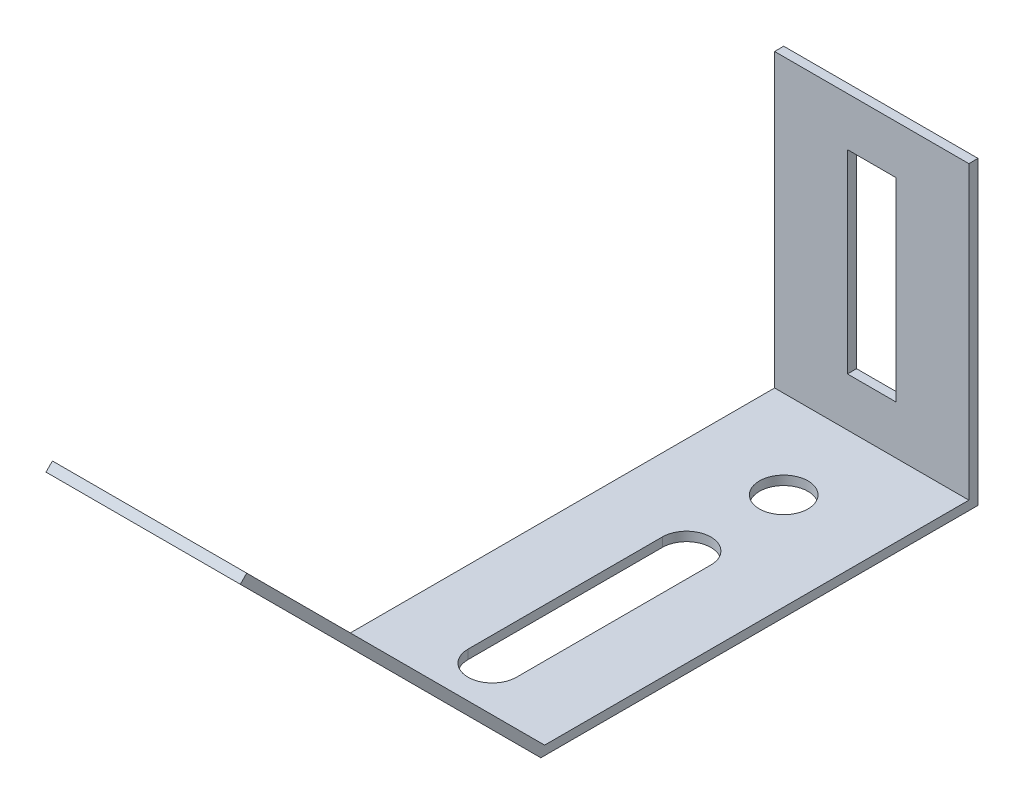
ISO-10303-21;
HEADER;
FILE_DESCRIPTION(('STEP AP214'),'2;1');
FILE_NAME('part.step','',(''),(''),'','','');
FILE_SCHEMA(('AUTOMOTIVE_DESIGN { 1 0 10303 214 1 1 1 1 }'));
ENDSEC;
DATA;
#1=APPLICATION_CONTEXT('core data for automotive mechanical design processes');
#2=APPLICATION_PROTOCOL_DEFINITION('international standard','automotive_design',2000,#1);
#3=PRODUCT_CONTEXT('',#1,'mechanical');
#4=PRODUCT('Part','Part','',(#3));
#5=PRODUCT_RELATED_PRODUCT_CATEGORY('part','',(#4));
#6=PRODUCT_DEFINITION_FORMATION('','',#4);
#7=PRODUCT_DEFINITION_CONTEXT('part definition',#1,'design');
#8=PRODUCT_DEFINITION('design','',#6,#7);
#9=PRODUCT_DEFINITION_SHAPE('','',#8);
#10=(LENGTH_UNIT() NAMED_UNIT(*) SI_UNIT(.MILLI.,.METRE.));
#11=(NAMED_UNIT(*) PLANE_ANGLE_UNIT() SI_UNIT($,.RADIAN.));
#12=(NAMED_UNIT(*) SI_UNIT($,.STERADIAN.) SOLID_ANGLE_UNIT());
#13=UNCERTAINTY_MEASURE_WITH_UNIT(LENGTH_MEASURE(1.E-05),#10,'distance_accuracy_value','');
#14=(GEOMETRIC_REPRESENTATION_CONTEXT(3) GLOBAL_UNCERTAINTY_ASSIGNED_CONTEXT((#13)) GLOBAL_UNIT_ASSIGNED_CONTEXT((#10,
#11,#12)) REPRESENTATION_CONTEXT('',''));
#15=CARTESIAN_POINT('',(0.,0.,0.));
#16=DIRECTION('',(0.,0.,1.));
#17=DIRECTION('',(1.,0.,0.));
#18=AXIS2_PLACEMENT_3D('',#15,#16,#17);
#19=CARTESIAN_POINT('',(0.,0.5953125,0.));
#20=DIRECTION('',(0.,-1.,0.));
#21=DIRECTION('',(0.,0.,-1.));
#22=AXIS2_PLACEMENT_3D('',#19,#20,#21);
#23=PLANE('',#22);
#24=CARTESIAN_POINT('',(0.,0.5953125,-7.9375));
#25=DIRECTION('',(0.,1.,0.));
#26=DIRECTION('',(0.,0.,1.));
#27=AXIS2_PLACEMENT_3D('',#24,#25,#26);
#28=CIRCLE('',#27,1.5875);
#29=CARTESIAN_POINT('',(0.,0.5953125,-9.525));
#30=VERTEX_POINT('',#29);
#31=EDGE_CURVE('E259',#30,#30,#28,.T.);
#32=ORIENTED_EDGE('',*,*,#31,.F.);
#33=EDGE_LOOP('',(#32));
#34=FACE_BOUND('',#33,.T.);
#35=DIRECTION('',(0.,0.,1.));
#36=VECTOR('',#35,1.);
#37=CARTESIAN_POINT('',(-6.35,0.5953125,14.2875));
#38=LINE('',#37,#36);
#39=CARTESIAN_POINT('',(-6.35,0.5953125,-13.6921875));
#40=VERTEX_POINT('',#39);
#41=CARTESIAN_POINT('',(-6.35,0.5953125,14.0409134886498));
#42=VERTEX_POINT('',#41);
#43=EDGE_CURVE('E53',#40,#42,#38,.T.);
#44=ORIENTED_EDGE('',*,*,#43,.T.);
#45=DIRECTION('',(1.,0.,0.));
#46=VECTOR('',#45,1.);
#47=CARTESIAN_POINT('',(-34.6049556212387,0.595312500000001,14.0409134886498));
#48=LINE('',#47,#46);
#49=CARTESIAN_POINT('',(6.35,0.5953125,14.0409134886498));
#50=VERTEX_POINT('',#49);
#51=EDGE_CURVE('E48',#42,#50,#48,.T.);
#52=ORIENTED_EDGE('',*,*,#51,.T.);
#53=DIRECTION('',(0.,0.,-1.));
#54=VECTOR('',#53,1.);
#55=CARTESIAN_POINT('',(6.35,0.5953125,14.2875));
#56=LINE('',#55,#54);
#57=CARTESIAN_POINT('',(6.35,0.5953125,-13.6921875));
#58=VERTEX_POINT('',#57);
#59=EDGE_CURVE('E167',#50,#58,#56,.T.);
#60=ORIENTED_EDGE('',*,*,#59,.T.);
#61=DIRECTION('',(-1.,0.,0.));
#62=VECTOR('',#61,1.);
#63=CARTESIAN_POINT('',(6.35,0.5953125,-13.6921875));
#64=LINE('',#63,#62);
#65=EDGE_CURVE('E211',#58,#40,#64,.T.);
#66=ORIENTED_EDGE('',*,*,#65,.T.);
#67=EDGE_LOOP('',(#44,#52,#60,#66));
#68=FACE_BOUND('',#67,.T.);
#69=CARTESIAN_POINT('',(0.,0.5953125,-1.5875));
#70=DIRECTION('',(0.,1.,0.));
#71=DIRECTION('',(0.,0.,1.));
#72=AXIS2_PLACEMENT_3D('',#69,#70,#71);
#73=CIRCLE('',#72,1.5875);
#74=CARTESIAN_POINT('',(1.5875,0.5953125,-1.5875));
#75=VERTEX_POINT('',#74);
#76=CARTESIAN_POINT('',(-1.5875,0.5953125,-1.5875));
#77=VERTEX_POINT('',#76);
#78=EDGE_CURVE('E228',#75,#77,#73,.T.);
#79=ORIENTED_EDGE('',*,*,#78,.F.);
#80=DIRECTION('',(0.,0.,-1.));
#81=VECTOR('',#80,1.);
#82=CARTESIAN_POINT('',(1.5875,0.5953125,-1.5875));
#83=LINE('',#82,#81);
#84=CARTESIAN_POINT('',(1.5875,0.5953125,11.1125));
#85=VERTEX_POINT('',#84);
#86=EDGE_CURVE('E236',#85,#75,#83,.T.);
#87=ORIENTED_EDGE('',*,*,#86,.F.);
#88=CARTESIAN_POINT('',(0.,0.5953125,11.1125));
#89=DIRECTION('',(0.,1.,0.));
#90=DIRECTION('',(0.,0.,1.));
#91=AXIS2_PLACEMENT_3D('',#88,#89,#90);
#92=CIRCLE('',#91,1.5875);
#93=CARTESIAN_POINT('',(-1.5875,0.5953125,11.1125));
#94=VERTEX_POINT('',#93);
#95=EDGE_CURVE('E233',#94,#85,#92,.T.);
#96=ORIENTED_EDGE('',*,*,#95,.F.);
#97=DIRECTION('',(0.,0.,1.));
#98=VECTOR('',#97,1.);
#99=CARTESIAN_POINT('',(-1.5875,0.5953125,-1.5875));
#100=LINE('',#99,#98);
#101=EDGE_CURVE('E230',#77,#94,#100,.T.);
#102=ORIENTED_EDGE('',*,*,#101,.F.);
#103=EDGE_LOOP('',(#79,#87,#96,#102));
#104=FACE_BOUND('',#103,.T.);
#105=ADVANCED_FACE('F33',(#34,#68,#104),#23,.F.);
#106=CARTESIAN_POINT('',(0.,0.,0.));
#107=DIRECTION('',(0.,-1.,0.));
#108=DIRECTION('',(0.,0.,-1.));
#109=AXIS2_PLACEMENT_3D('',#106,#107,#108);
#110=PLANE('',#109);
#111=DIRECTION('',(0.,0.,-1.));
#112=VECTOR('',#111,1.);
#113=CARTESIAN_POINT('',(6.35,0.,14.2875));
#114=LINE('',#113,#112);
#115=CARTESIAN_POINT('',(6.35,0.,14.2875));
#116=VERTEX_POINT('',#115);
#117=CARTESIAN_POINT('',(6.35,0.,-14.2875));
#118=VERTEX_POINT('',#117);
#119=EDGE_CURVE('E262',#116,#118,#114,.T.);
#120=ORIENTED_EDGE('',*,*,#119,.F.);
#121=DIRECTION('',(1.,0.,0.));
#122=VECTOR('',#121,1.);
#123=CARTESIAN_POINT('',(-6.35,0.,14.2875));
#124=LINE('',#123,#122);
#125=CARTESIAN_POINT('',(-6.34999999999999,0.,14.2875));
#126=VERTEX_POINT('',#125);
#127=EDGE_CURVE('E266',#126,#116,#124,.T.);
#128=ORIENTED_EDGE('',*,*,#127,.F.);
#129=DIRECTION('',(0.,0.,1.));
#130=VECTOR('',#129,1.);
#131=CARTESIAN_POINT('',(-6.35,0.,14.2875));
#132=LINE('',#131,#130);
#133=CARTESIAN_POINT('',(-6.35,0.,-14.2875));
#134=VERTEX_POINT('',#133);
#135=EDGE_CURVE('E272',#134,#126,#132,.T.);
#136=ORIENTED_EDGE('',*,*,#135,.F.);
#137=DIRECTION('',(-1.,0.,0.));
#138=VECTOR('',#137,1.);
#139=CARTESIAN_POINT('',(-6.35,0.,-14.2875));
#140=LINE('',#139,#138);
#141=EDGE_CURVE('E270',#118,#134,#140,.T.);
#142=ORIENTED_EDGE('',*,*,#141,.F.);
#143=EDGE_LOOP('',(#120,#128,#136,#142));
#144=FACE_BOUND('',#143,.T.);
#145=CARTESIAN_POINT('',(0.,0.,-7.9375));
#146=DIRECTION('',(0.,1.,0.));
#147=DIRECTION('',(0.,0.,1.));
#148=AXIS2_PLACEMENT_3D('',#145,#146,#147);
#149=CIRCLE('',#148,1.5875);
#150=CARTESIAN_POINT('',(0.,0.,-9.525));
#151=VERTEX_POINT('',#150);
#152=EDGE_CURVE('E258',#151,#151,#149,.T.);
#153=ORIENTED_EDGE('',*,*,#152,.T.);
#154=EDGE_LOOP('',(#153));
#155=FACE_BOUND('',#154,.T.);
#156=DIRECTION('',(0.,0.,-1.));
#157=VECTOR('',#156,1.);
#158=CARTESIAN_POINT('',(1.5875,0.,-1.5875));
#159=LINE('',#158,#157);
#160=CARTESIAN_POINT('',(1.5875,0.,11.1125));
#161=VERTEX_POINT('',#160);
#162=CARTESIAN_POINT('',(1.5875,0.,-1.5875));
#163=VERTEX_POINT('',#162);
#164=EDGE_CURVE('E231',#161,#163,#159,.T.);
#165=ORIENTED_EDGE('',*,*,#164,.T.);
#166=CARTESIAN_POINT('',(0.,0.,-1.5875));
#167=DIRECTION('',(0.,1.,0.));
#168=DIRECTION('',(0.,0.,1.));
#169=AXIS2_PLACEMENT_3D('',#166,#167,#168);
#170=CIRCLE('',#169,1.5875);
#171=CARTESIAN_POINT('',(-1.5875,0.,-1.5875));
#172=VERTEX_POINT('',#171);
#173=EDGE_CURVE('E225',#163,#172,#170,.T.);
#174=ORIENTED_EDGE('',*,*,#173,.T.);
#175=DIRECTION('',(0.,0.,1.));
#176=VECTOR('',#175,1.);
#177=CARTESIAN_POINT('',(-1.5875,0.,-1.5875));
#178=LINE('',#177,#176);
#179=CARTESIAN_POINT('',(-1.5875,0.,11.1125));
#180=VERTEX_POINT('',#179);
#181=EDGE_CURVE('E241',#172,#180,#178,.T.);
#182=ORIENTED_EDGE('',*,*,#181,.T.);
#183=CARTESIAN_POINT('',(0.,0.,11.1125));
#184=DIRECTION('',(0.,1.,0.));
#185=DIRECTION('',(0.,0.,1.));
#186=AXIS2_PLACEMENT_3D('',#183,#184,#185);
#187=CIRCLE('',#186,1.5875);
#188=EDGE_CURVE('E244',#180,#161,#187,.T.);
#189=ORIENTED_EDGE('',*,*,#188,.T.);
#190=EDGE_LOOP('',(#165,#174,#182,#189));
#191=FACE_BOUND('',#190,.T.);
#192=ADVANCED_FACE('F284',(#144,#155,#191),#110,.T.);
#193=CARTESIAN_POINT('',(6.35,0.5953125,14.2875));
#194=DIRECTION('',(-1.,0.,0.));
#195=DIRECTION('',(0.,0.,1.));
#196=AXIS2_PLACEMENT_3D('',#193,#194,#195);
#197=PLANE('',#196);
#198=ORIENTED_EDGE('',*,*,#59,.F.);
#199=DIRECTION('',(0.,0.707106781186544,0.707106781186551));
#200=VECTOR('',#199,1.);
#201=CARTESIAN_POINT('',(6.35,0.595312500000001,14.0409134886498));
#202=LINE('',#201,#200);
#203=CARTESIAN_POINT('',(6.35,20.0662620056751,33.5118629943251));
#204=VERTEX_POINT('',#203);
#205=EDGE_CURVE('E151',#50,#204,#202,.T.);
#206=ORIENTED_EDGE('',*,*,#205,.T.);
#207=DIRECTION('',(0.,-0.707106781186556,0.707106781186539));
#208=VECTOR('',#207,1.);
#209=CARTESIAN_POINT('',(6.35,20.0662620056751,33.5118629943251));
#210=LINE('',#209,#208);
#211=CARTESIAN_POINT('',(6.35,19.6453125,33.9328125000002));
#212=VERTEX_POINT('',#211);
#213=EDGE_CURVE('E158',#204,#212,#210,.T.);
#214=ORIENTED_EDGE('',*,*,#213,.T.);
#215=DIRECTION('',(0.,-0.707106781186543,-0.707106781186551));
#216=VECTOR('',#215,1.);
#217=CARTESIAN_POINT('',(6.35,0.,14.2875));
#218=LINE('',#217,#216);
#219=EDGE_CURVE('E164',#212,#116,#218,.T.);
#220=ORIENTED_EDGE('',*,*,#219,.T.);
#221=ORIENTED_EDGE('',*,*,#119,.T.);
#222=DIRECTION('',(0.,-1.,0.));
#223=VECTOR('',#222,1.);
#224=CARTESIAN_POINT('',(6.35,0.5953125,-14.2875));
#225=LINE('',#224,#223);
#226=CARTESIAN_POINT('',(6.35,19.6453125,-14.2875));
#227=VERTEX_POINT('',#226);
#228=EDGE_CURVE('E11',#227,#118,#225,.T.);
#229=ORIENTED_EDGE('',*,*,#228,.F.);
#230=DIRECTION('',(0.,0.,-1.));
#231=VECTOR('',#230,1.);
#232=CARTESIAN_POINT('',(6.35,19.6453125,-13.6921875));
#233=LINE('',#232,#231);
#234=CARTESIAN_POINT('',(6.35,19.6453125,-13.6921875));
#235=VERTEX_POINT('',#234);
#236=EDGE_CURVE('E222',#235,#227,#233,.T.);
#237=ORIENTED_EDGE('',*,*,#236,.F.);
#238=DIRECTION('',(0.,-1.,0.));
#239=VECTOR('',#238,1.);
#240=CARTESIAN_POINT('',(6.35,0.5953125,-13.6921875));
#241=LINE('',#240,#239);
#242=EDGE_CURVE('E209',#235,#58,#241,.T.);
#243=ORIENTED_EDGE('',*,*,#242,.T.);
#244=EDGE_LOOP('',(#198,#206,#214,#220,#221,#229,#237,#243));
#245=FACE_BOUND('',#244,.T.);
#246=ADVANCED_FACE('F35',(#245),#197,.F.);
#247=CARTESIAN_POINT('',(-6.35,0.5953125,-14.2875));
#248=DIRECTION('',(0.,0.,1.));
#249=DIRECTION('',(1.,0.,0.));
#250=AXIS2_PLACEMENT_3D('',#247,#248,#249);
#251=PLANE('',#250);
#252=ORIENTED_EDGE('',*,*,#141,.T.);
#253=DIRECTION('',(0.,-1.,0.));
#254=VECTOR('',#253,1.);
#255=CARTESIAN_POINT('',(-6.35,0.5953125,-14.2875));
#256=LINE('',#255,#254);
#257=CARTESIAN_POINT('',(-6.35,19.6453125,-14.2875));
#258=VERTEX_POINT('',#257);
#259=EDGE_CURVE('E41',#258,#134,#256,.T.);
#260=ORIENTED_EDGE('',*,*,#259,.F.);
#261=DIRECTION('',(1.,0.,0.));
#262=VECTOR('',#261,1.);
#263=CARTESIAN_POINT('',(6.35,19.6453125,-14.2875));
#264=LINE('',#263,#262);
#265=EDGE_CURVE('E202',#258,#227,#264,.T.);
#266=ORIENTED_EDGE('',*,*,#265,.T.);
#267=ORIENTED_EDGE('',*,*,#228,.T.);
#268=EDGE_LOOP('',(#252,#260,#266,#267));
#269=FACE_BOUND('',#268,.T.);
#270=DIRECTION('',(1.,0.,0.));
#271=VECTOR('',#270,1.);
#272=CARTESIAN_POINT('',(-1.5875,16.4703125,-14.2875));
#273=LINE('',#272,#271);
#274=CARTESIAN_POINT('',(-1.5875,16.4703125,-14.2875));
#275=VERTEX_POINT('',#274);
#276=CARTESIAN_POINT('',(1.5875,16.4703125,-14.2875));
#277=VERTEX_POINT('',#276);
#278=EDGE_CURVE('E192',#275,#277,#273,.T.);
#279=ORIENTED_EDGE('',*,*,#278,.F.);
#280=DIRECTION('',(0.,1.,0.));
#281=VECTOR('',#280,1.);
#282=CARTESIAN_POINT('',(-1.5875,16.4703125,-14.2875));
#283=LINE('',#282,#281);
#284=CARTESIAN_POINT('',(-1.5875,3.7703125,-14.2875));
#285=VERTEX_POINT('',#284);
#286=EDGE_CURVE('E190',#285,#275,#283,.T.);
#287=ORIENTED_EDGE('',*,*,#286,.F.);
#288=DIRECTION('',(-1.,0.,0.));
#289=VECTOR('',#288,1.);
#290=CARTESIAN_POINT('',(-1.5875,3.7703125,-14.2875));
#291=LINE('',#290,#289);
#292=CARTESIAN_POINT('',(1.5875,3.7703125,-14.2875));
#293=VERTEX_POINT('',#292);
#294=EDGE_CURVE('E180',#293,#285,#291,.T.);
#295=ORIENTED_EDGE('',*,*,#294,.F.);
#296=DIRECTION('',(0.,-1.,0.));
#297=VECTOR('',#296,1.);
#298=CARTESIAN_POINT('',(1.5875,16.4703125,-14.2875));
#299=LINE('',#298,#297);
#300=EDGE_CURVE('E195',#277,#293,#299,.T.);
#301=ORIENTED_EDGE('',*,*,#300,.F.);
#302=EDGE_LOOP('',(#279,#287,#295,#301));
#303=FACE_BOUND('',#302,.T.);
#304=ADVANCED_FACE('F292',(#269,#303),#251,.F.);
#305=CARTESIAN_POINT('',(-6.35,0.5953125,14.2875));
#306=DIRECTION('',(1.,0.,0.));
#307=DIRECTION('',(0.,0.,-1.));
#308=AXIS2_PLACEMENT_3D('',#305,#306,#307);
#309=PLANE('',#308);
#310=ORIENTED_EDGE('',*,*,#135,.T.);
#311=DIRECTION('',(0.,0.707106781186544,0.707106781186552));
#312=VECTOR('',#311,1.);
#313=CARTESIAN_POINT('',(-6.34999999999999,0.,14.2875));
#314=LINE('',#313,#312);
#315=CARTESIAN_POINT('',(-6.35,19.6453125,33.9328125000002));
#316=VERTEX_POINT('',#315);
#317=EDGE_CURVE('E170',#126,#316,#314,.T.);
#318=ORIENTED_EDGE('',*,*,#317,.T.);
#319=DIRECTION('',(0.,0.707106781186556,-0.707106781186539));
#320=VECTOR('',#319,1.);
#321=CARTESIAN_POINT('',(-6.35,20.0662620056751,33.5118629943251));
#322=LINE('',#321,#320);
#323=CARTESIAN_POINT('',(-6.35,20.0662620056751,33.5118629943251));
#324=VERTEX_POINT('',#323);
#325=EDGE_CURVE('E318',#316,#324,#322,.T.);
#326=ORIENTED_EDGE('',*,*,#325,.T.);
#327=DIRECTION('',(0.,-0.707106781186544,-0.707106781186551));
#328=VECTOR('',#327,1.);
#329=CARTESIAN_POINT('',(-6.35,0.595312500000001,14.0409134886498));
#330=LINE('',#329,#328);
#331=EDGE_CURVE('E152',#324,#42,#330,.T.);
#332=ORIENTED_EDGE('',*,*,#331,.T.);
#333=ORIENTED_EDGE('',*,*,#43,.F.);
#334=DIRECTION('',(0.,1.,0.));
#335=VECTOR('',#334,1.);
#336=CARTESIAN_POINT('',(-6.35,0.5953125,-13.6921875));
#337=LINE('',#336,#335);
#338=CARTESIAN_POINT('',(-6.35,19.6453125,-13.6921875));
#339=VERTEX_POINT('',#338);
#340=EDGE_CURVE('E213',#40,#339,#337,.T.);
#341=ORIENTED_EDGE('',*,*,#340,.T.);
#342=DIRECTION('',(0.,0.,-1.));
#343=VECTOR('',#342,1.);
#344=CARTESIAN_POINT('',(-6.35,19.6453125,-13.6921875));
#345=LINE('',#344,#343);
#346=EDGE_CURVE('E219',#339,#258,#345,.T.);
#347=ORIENTED_EDGE('',*,*,#346,.T.);
#348=ORIENTED_EDGE('',*,*,#259,.T.);
#349=EDGE_LOOP('',(#310,#318,#326,#332,#333,#341,#347,#348));
#350=FACE_BOUND('',#349,.T.);
#351=ADVANCED_FACE('F279',(#350),#309,.F.);
#352=CARTESIAN_POINT('',(0.,0.5953125,-7.9375));
#353=DIRECTION('',(0.,-1.,0.));
#354=DIRECTION('',(0.,0.,-1.));
#355=AXIS2_PLACEMENT_3D('',#352,#353,#354);
#356=CYLINDRICAL_SURFACE('',#355,1.5875);
#357=CARTESIAN_POINT('',(0.,0.5953125,-9.525));
#358=CARTESIAN_POINT('',(0.,0.589111328125,-9.525));
#359=CARTESIAN_POINT('',(0.,0.58291015625,-9.525));
#360=CARTESIAN_POINT('',(0.,0.5705078125,-9.525));
#361=CARTESIAN_POINT('',(0.,0.564306640625,-9.525));
#362=CARTESIAN_POINT('',(0.,0.551904296875,-9.525));
#363=CARTESIAN_POINT('',(0.,0.545703125,-9.525));
#364=CARTESIAN_POINT('',(0.,0.53330078125,-9.525));
#365=CARTESIAN_POINT('',(0.,0.527099609375,-9.525));
#366=CARTESIAN_POINT('',(0.,0.514697265625,-9.525));
#367=CARTESIAN_POINT('',(0.,0.50849609375,-9.525));
#368=CARTESIAN_POINT('',(0.,0.49609375,-9.525));
#369=CARTESIAN_POINT('',(0.,0.489892578125,-9.525));
#370=CARTESIAN_POINT('',(0.,0.477490234375,-9.525));
#371=CARTESIAN_POINT('',(0.,0.4712890625,-9.525));
#372=CARTESIAN_POINT('',(0.,0.45888671875,-9.525));
#373=CARTESIAN_POINT('',(0.,0.452685546875,-9.525));
#374=CARTESIAN_POINT('',(0.,0.440283203125,-9.525));
#375=CARTESIAN_POINT('',(0.,0.43408203125,-9.525));
#376=CARTESIAN_POINT('',(0.,0.4216796875,-9.525));
#377=CARTESIAN_POINT('',(0.,0.415478515625,-9.525));
#378=CARTESIAN_POINT('',(0.,0.403076171875,-9.525));
#379=CARTESIAN_POINT('',(0.,0.396875,-9.525));
#380=CARTESIAN_POINT('',(0.,0.38447265625,-9.525));
#381=CARTESIAN_POINT('',(0.,0.378271484375,-9.525));
#382=CARTESIAN_POINT('',(0.,0.365869140625,-9.525));
#383=CARTESIAN_POINT('',(0.,0.35966796875,-9.525));
#384=CARTESIAN_POINT('',(0.,0.347265625,-9.525));
#385=CARTESIAN_POINT('',(0.,0.341064453125,-9.525));
#386=CARTESIAN_POINT('',(0.,0.328662109375,-9.525));
#387=CARTESIAN_POINT('',(0.,0.3224609375,-9.525));
#388=CARTESIAN_POINT('',(0.,0.31005859375,-9.525));
#389=CARTESIAN_POINT('',(0.,0.303857421875,-9.525));
#390=CARTESIAN_POINT('',(0.,0.291455078125,-9.525));
#391=CARTESIAN_POINT('',(0.,0.28525390625,-9.525));
#392=CARTESIAN_POINT('',(0.,0.2728515625,-9.525));
#393=CARTESIAN_POINT('',(0.,0.266650390625,-9.525));
#394=CARTESIAN_POINT('',(0.,0.254248046875,-9.525));
#395=CARTESIAN_POINT('',(0.,0.248046875,-9.525));
#396=CARTESIAN_POINT('',(0.,0.23564453125,-9.525));
#397=CARTESIAN_POINT('',(0.,0.229443359375,-9.525));
#398=CARTESIAN_POINT('',(0.,0.217041015625,-9.525));
#399=CARTESIAN_POINT('',(0.,0.21083984375,-9.525));
#400=CARTESIAN_POINT('',(0.,0.1984375,-9.525));
#401=CARTESIAN_POINT('',(0.,0.192236328125,-9.525));
#402=CARTESIAN_POINT('',(0.,0.179833984375,-9.525));
#403=CARTESIAN_POINT('',(0.,0.1736328125,-9.525));
#404=CARTESIAN_POINT('',(0.,0.16123046875,-9.525));
#405=CARTESIAN_POINT('',(0.,0.155029296875,-9.525));
#406=CARTESIAN_POINT('',(0.,0.142626953125,-9.525));
#407=CARTESIAN_POINT('',(0.,0.13642578125,-9.525));
#408=CARTESIAN_POINT('',(0.,0.1240234375,-9.525));
#409=CARTESIAN_POINT('',(0.,0.117822265625,-9.525));
#410=CARTESIAN_POINT('',(0.,0.105419921875,-9.525));
#411=CARTESIAN_POINT('',(0.,0.09921875,-9.525));
#412=CARTESIAN_POINT('',(0.,0.08681640625,-9.525));
#413=CARTESIAN_POINT('',(0.,0.0806152343750001,-9.525));
#414=CARTESIAN_POINT('',(0.,0.068212890625,-9.525));
#415=CARTESIAN_POINT('',(0.,0.06201171875,-9.525));
#416=CARTESIAN_POINT('',(0.,0.049609375,-9.525));
#417=CARTESIAN_POINT('',(0.,0.043408203125,-9.525));
#418=CARTESIAN_POINT('',(0.,0.031005859375,-9.525));
#419=CARTESIAN_POINT('',(0.,0.0248046875,-9.525));
#420=CARTESIAN_POINT('',(0.,0.01240234375,-9.525));
#421=CARTESIAN_POINT('',(0.,0.00620117187500001,-9.525));
#422=CARTESIAN_POINT('',(0.,0.,-9.525));
#423=B_SPLINE_CURVE_WITH_KNOTS('',3,(#357,#358,#359,#360,#361,#362,#363,#364,#365,#366,#367,
#368,#369,#370,#371,#372,#373,#374,#375,#376,#377,#378,#379,#380,#381,#382,#383,#384,#385,#386,
#387,#388,#389,#390,#391,#392,#393,#394,#395,#396,#397,#398,#399,#400,#401,#402,#403,#404,#405,
#406,#407,#408,#409,#410,#411,#412,#413,#414,#415,#416,#417,#418,#419,#420,#421,#422),
.UNSPECIFIED.,.F.,.F.,(4,2,2,2,2,2,2,2,2,2,2,2,2,2,2,2,2,2,2,2,2,2,2,2,2,2,2,2,2,2,2,2,4),(0.,
0.0186035156249999,0.0372070312499999,0.0558105468749999,0.0744140624999999,0.0930175781249999,
0.11162109375,0.130224609375,0.148828125,0.167431640625,0.18603515625,0.204638671875,
0.2232421875,0.241845703125,0.26044921875,0.279052734375,0.29765625,0.316259765625,
0.33486328125,0.353466796875,0.3720703125,0.390673828125,0.40927734375,0.427880859375,
0.446484375,0.465087890625,0.48369140625,0.502294921875,0.5208984375,0.539501953125,
0.55810546875,0.576708984375,0.5953125),.UNSPECIFIED.);
#424=EDGE_CURVE('BSEAM353',#30,#151,#423,.T.);
#425=ORIENTED_EDGE('',*,*,#31,.T.);
#426=ORIENTED_EDGE('',*,*,#152,.F.);
#427=ORIENTED_EDGE('',*,*,#424,.T.);
#428=ORIENTED_EDGE('',*,*,#424,.F.);
#429=EDGE_LOOP('',(#425,#427,#426,#428));
#430=FACE_BOUND('',#429,.T.);
#431=ADVANCED_FACE('F353',(#430),#356,.F.);
#432=CARTESIAN_POINT('',(0.,0.5953125,-1.5875));
#433=DIRECTION('',(0.,-1.,0.));
#434=DIRECTION('',(0.,0.,-1.));
#435=AXIS2_PLACEMENT_3D('',#432,#433,#434);
#436=CYLINDRICAL_SURFACE('',#435,1.5875);
#437=ORIENTED_EDGE('',*,*,#173,.F.);
#438=DIRECTION('',(0.,-1.,0.));
#439=VECTOR('',#438,1.);
#440=CARTESIAN_POINT('',(1.5875,0.5953125,-1.5875));
#441=LINE('',#440,#439);
#442=EDGE_CURVE('E238',#75,#163,#441,.T.);
#443=ORIENTED_EDGE('',*,*,#442,.F.);
#444=ORIENTED_EDGE('',*,*,#78,.T.);
#445=DIRECTION('',(0.,-1.,0.));
#446=VECTOR('',#445,1.);
#447=CARTESIAN_POINT('',(-1.5875,0.5953125,-1.5875));
#448=LINE('',#447,#446);
#449=EDGE_CURVE('E255',#77,#172,#448,.T.);
#450=ORIENTED_EDGE('',*,*,#449,.T.);
#451=EDGE_LOOP('',(#437,#443,#444,#450));
#452=FACE_BOUND('',#451,.T.);
#453=ADVANCED_FACE('F330',(#452),#436,.F.);
#454=CARTESIAN_POINT('',(-1.5875,0.5953125,-1.5875));
#455=DIRECTION('',(1.,0.,0.));
#456=DIRECTION('',(0.,0.,-1.));
#457=AXIS2_PLACEMENT_3D('',#454,#455,#456);
#458=PLANE('',#457);
#459=ORIENTED_EDGE('',*,*,#181,.F.);
#460=ORIENTED_EDGE('',*,*,#449,.F.);
#461=ORIENTED_EDGE('',*,*,#101,.T.);
#462=DIRECTION('',(0.,-1.,0.));
#463=VECTOR('',#462,1.);
#464=CARTESIAN_POINT('',(-1.5875,0.5953125,11.1125));
#465=LINE('',#464,#463);
#466=EDGE_CURVE('E253',#94,#180,#465,.T.);
#467=ORIENTED_EDGE('',*,*,#466,.T.);
#468=EDGE_LOOP('',(#459,#460,#461,#467));
#469=FACE_BOUND('',#468,.T.);
#470=ADVANCED_FACE('F332',(#469),#458,.T.);
#471=CARTESIAN_POINT('',(0.,0.5953125,11.1125));
#472=DIRECTION('',(0.,-1.,0.));
#473=DIRECTION('',(0.,0.,-1.));
#474=AXIS2_PLACEMENT_3D('',#471,#472,#473);
#475=CYLINDRICAL_SURFACE('',#474,1.5875);
#476=ORIENTED_EDGE('',*,*,#188,.F.);
#477=ORIENTED_EDGE('',*,*,#466,.F.);
#478=ORIENTED_EDGE('',*,*,#95,.T.);
#479=DIRECTION('',(0.,-1.,0.));
#480=VECTOR('',#479,1.);
#481=CARTESIAN_POINT('',(1.5875,0.5953125,11.1125));
#482=LINE('',#481,#480);
#483=EDGE_CURVE('E251',#85,#161,#482,.T.);
#484=ORIENTED_EDGE('',*,*,#483,.T.);
#485=EDGE_LOOP('',(#476,#477,#478,#484));
#486=FACE_BOUND('',#485,.T.);
#487=ADVANCED_FACE('F340',(#486),#475,.F.);
#488=CARTESIAN_POINT('',(1.5875,0.5953125,-1.5875));
#489=DIRECTION('',(-1.,0.,0.));
#490=DIRECTION('',(0.,0.,1.));
#491=AXIS2_PLACEMENT_3D('',#488,#489,#490);
#492=PLANE('',#491);
#493=ORIENTED_EDGE('',*,*,#164,.F.);
#494=ORIENTED_EDGE('',*,*,#483,.F.);
#495=ORIENTED_EDGE('',*,*,#86,.T.);
#496=ORIENTED_EDGE('',*,*,#442,.T.);
#497=EDGE_LOOP('',(#493,#494,#495,#496));
#498=FACE_BOUND('',#497,.T.);
#499=ADVANCED_FACE('F338',(#498),#492,.T.);
#500=CARTESIAN_POINT('',(6.35,19.6453125,-13.6921875));
#501=DIRECTION('',(0.,1.,0.));
#502=DIRECTION('',(0.,0.,1.));
#503=AXIS2_PLACEMENT_3D('',#500,#501,#502);
#504=PLANE('',#503);
#505=ORIENTED_EDGE('',*,*,#265,.F.);
#506=ORIENTED_EDGE('',*,*,#346,.F.);
#507=DIRECTION('',(1.,0.,0.));
#508=VECTOR('',#507,1.);
#509=CARTESIAN_POINT('',(6.35,19.6453125,-13.6921875));
#510=LINE('',#509,#508);
#511=EDGE_CURVE('E216',#339,#235,#510,.T.);
#512=ORIENTED_EDGE('',*,*,#511,.T.);
#513=ORIENTED_EDGE('',*,*,#236,.T.);
#514=EDGE_LOOP('',(#505,#506,#512,#513));
#515=FACE_BOUND('',#514,.T.);
#516=ADVANCED_FACE('F290',(#515),#504,.T.);
#517=CARTESIAN_POINT('',(0.,0.,-13.6921875));
#518=DIRECTION('',(0.,0.,1.));
#519=DIRECTION('',(1.,0.,0.));
#520=AXIS2_PLACEMENT_3D('',#517,#518,#519);
#521=PLANE('',#520);
#522=DIRECTION('',(0.,1.,0.));
#523=VECTOR('',#522,1.);
#524=CARTESIAN_POINT('',(-1.5875,16.4703125,-13.6921875));
#525=LINE('',#524,#523);
#526=CARTESIAN_POINT('',(-1.5875,3.7703125,-13.6921875));
#527=VERTEX_POINT('',#526);
#528=CARTESIAN_POINT('',(-1.5875,16.4703125,-13.6921875));
#529=VERTEX_POINT('',#528);
#530=EDGE_CURVE('E176',#527,#529,#525,.T.);
#531=ORIENTED_EDGE('',*,*,#530,.T.);
#532=DIRECTION('',(1.,0.,0.));
#533=VECTOR('',#532,1.);
#534=CARTESIAN_POINT('',(-1.5875,16.4703125,-13.6921875));
#535=LINE('',#534,#533);
#536=CARTESIAN_POINT('',(1.5875,16.4703125,-13.6921875));
#537=VERTEX_POINT('',#536);
#538=EDGE_CURVE('E179',#529,#537,#535,.T.);
#539=ORIENTED_EDGE('',*,*,#538,.T.);
#540=DIRECTION('',(0.,-1.,0.));
#541=VECTOR('',#540,1.);
#542=CARTESIAN_POINT('',(1.5875,16.4703125,-13.6921875));
#543=LINE('',#542,#541);
#544=CARTESIAN_POINT('',(1.5875,3.7703125,-13.6921875));
#545=VERTEX_POINT('',#544);
#546=EDGE_CURVE('E183',#537,#545,#543,.T.);
#547=ORIENTED_EDGE('',*,*,#546,.T.);
#548=DIRECTION('',(-1.,0.,0.));
#549=VECTOR('',#548,1.);
#550=CARTESIAN_POINT('',(-1.5875,3.7703125,-13.6921875));
#551=LINE('',#550,#549);
#552=EDGE_CURVE('E186',#545,#527,#551,.T.);
#553=ORIENTED_EDGE('',*,*,#552,.T.);
#554=EDGE_LOOP('',(#531,#539,#547,#553));
#555=FACE_BOUND('',#554,.T.);
#556=ORIENTED_EDGE('',*,*,#242,.F.);
#557=ORIENTED_EDGE('',*,*,#511,.F.);
#558=ORIENTED_EDGE('',*,*,#340,.F.);
#559=ORIENTED_EDGE('',*,*,#65,.F.);
#560=EDGE_LOOP('',(#556,#557,#558,#559));
#561=FACE_BOUND('',#560,.T.);
#562=ADVANCED_FACE('F312',(#555,#561),#521,.T.);
#563=CARTESIAN_POINT('',(-1.5875,16.4703125,-13.6921875));
#564=DIRECTION('',(-1.,0.,0.));
#565=DIRECTION('',(0.,-1.,0.));
#566=AXIS2_PLACEMENT_3D('',#563,#564,#565);
#567=PLANE('',#566);
#568=ORIENTED_EDGE('',*,*,#286,.T.);
#569=DIRECTION('',(0.,0.,-1.));
#570=VECTOR('',#569,1.);
#571=CARTESIAN_POINT('',(-1.5875,16.4703125,-13.6921875));
#572=LINE('',#571,#570);
#573=EDGE_CURVE('E189',#529,#275,#572,.T.);
#574=ORIENTED_EDGE('',*,*,#573,.F.);
#575=ORIENTED_EDGE('',*,*,#530,.F.);
#576=DIRECTION('',(0.,0.,-1.));
#577=VECTOR('',#576,1.);
#578=CARTESIAN_POINT('',(-1.5875,3.7703125,-13.6921875));
#579=LINE('',#578,#577);
#580=EDGE_CURVE('E200',#527,#285,#579,.T.);
#581=ORIENTED_EDGE('',*,*,#580,.T.);
#582=EDGE_LOOP('',(#568,#574,#575,#581));
#583=FACE_BOUND('',#582,.T.);
#584=ADVANCED_FACE('F305',(#583),#567,.F.);
#585=CARTESIAN_POINT('',(-1.5875,3.7703125,-13.6921875));
#586=DIRECTION('',(0.,-1.,0.));
#587=DIRECTION('',(0.,0.,-1.));
#588=AXIS2_PLACEMENT_3D('',#585,#586,#587);
#589=PLANE('',#588);
#590=ORIENTED_EDGE('',*,*,#294,.T.);
#591=ORIENTED_EDGE('',*,*,#580,.F.);
#592=ORIENTED_EDGE('',*,*,#552,.F.);
#593=DIRECTION('',(0.,0.,-1.));
#594=VECTOR('',#593,1.);
#595=CARTESIAN_POINT('',(1.5875,3.7703125,-13.6921875));
#596=LINE('',#595,#594);
#597=EDGE_CURVE('E203',#545,#293,#596,.T.);
#598=ORIENTED_EDGE('',*,*,#597,.T.);
#599=EDGE_LOOP('',(#590,#591,#592,#598));
#600=FACE_BOUND('',#599,.T.);
#601=ADVANCED_FACE('F308',(#600),#589,.F.);
#602=CARTESIAN_POINT('',(1.5875,16.4703125,-13.6921875));
#603=DIRECTION('',(1.,0.,0.));
#604=DIRECTION('',(0.,1.,0.));
#605=AXIS2_PLACEMENT_3D('',#602,#603,#604);
#606=PLANE('',#605);
#607=ORIENTED_EDGE('',*,*,#300,.T.);
#608=ORIENTED_EDGE('',*,*,#597,.F.);
#609=ORIENTED_EDGE('',*,*,#546,.F.);
#610=DIRECTION('',(0.,0.,-1.));
#611=VECTOR('',#610,1.);
#612=CARTESIAN_POINT('',(1.5875,16.4703125,-13.6921875));
#613=LINE('',#612,#611);
#614=EDGE_CURVE('E205',#537,#277,#613,.T.);
#615=ORIENTED_EDGE('',*,*,#614,.T.);
#616=EDGE_LOOP('',(#607,#608,#609,#615));
#617=FACE_BOUND('',#616,.T.);
#618=ADVANCED_FACE('F310',(#617),#606,.F.);
#619=CARTESIAN_POINT('',(-1.5875,16.4703125,-13.6921875));
#620=DIRECTION('',(0.,1.,0.));
#621=DIRECTION('',(0.,0.,1.));
#622=AXIS2_PLACEMENT_3D('',#619,#620,#621);
#623=PLANE('',#622);
#624=ORIENTED_EDGE('',*,*,#278,.T.);
#625=ORIENTED_EDGE('',*,*,#614,.F.);
#626=ORIENTED_EDGE('',*,*,#538,.F.);
#627=ORIENTED_EDGE('',*,*,#573,.T.);
#628=EDGE_LOOP('',(#624,#625,#626,#627));
#629=FACE_BOUND('',#628,.T.);
#630=ADVANCED_FACE('F301',(#629),#623,.F.);
#631=CARTESIAN_POINT('',(-34.6049556212387,0.,14.2875));
#632=DIRECTION('',(0.,-0.707106781186552,0.707106781186544));
#633=DIRECTION('',(0.,-0.707106781186544,-0.707106781186552));
#634=AXIS2_PLACEMENT_3D('',#631,#632,#633);
#635=PLANE('',#634);
#636=ORIENTED_EDGE('',*,*,#317,.F.);
#637=ORIENTED_EDGE('',*,*,#127,.T.);
#638=ORIENTED_EDGE('',*,*,#219,.F.);
#639=DIRECTION('',(1.,0.,0.));
#640=VECTOR('',#639,1.);
#641=CARTESIAN_POINT('',(-34.6049556212387,19.6453125,33.9328125000002));
#642=LINE('',#641,#640);
#643=EDGE_CURVE('E155',#316,#212,#642,.T.);
#644=ORIENTED_EDGE('',*,*,#643,.F.);
#645=EDGE_LOOP('',(#636,#637,#638,#644));
#646=FACE_BOUND('',#645,.T.);
#647=ADVANCED_FACE('F287',(#646),#635,.T.);
#648=CARTESIAN_POINT('',(-34.6049556212387,20.0662620056751,33.5118629943251));
#649=DIRECTION('',(0.,0.707106781186539,0.707106781186556));
#650=DIRECTION('',(0.,-0.707106781186556,0.707106781186539));
#651=AXIS2_PLACEMENT_3D('',#648,#649,#650);
#652=PLANE('',#651);
#653=ORIENTED_EDGE('',*,*,#325,.F.);
#654=ORIENTED_EDGE('',*,*,#643,.T.);
#655=ORIENTED_EDGE('',*,*,#213,.F.);
#656=DIRECTION('',(1.,0.,0.));
#657=VECTOR('',#656,1.);
#658=CARTESIAN_POINT('',(-34.6049556212387,20.0662620056751,33.5118629943251));
#659=LINE('',#658,#657);
#660=EDGE_CURVE('E147',#324,#204,#659,.T.);
#661=ORIENTED_EDGE('',*,*,#660,.F.);
#662=EDGE_LOOP('',(#653,#654,#655,#661));
#663=FACE_BOUND('',#662,.T.);
#664=ADVANCED_FACE('F159',(#663),#652,.T.);
#665=CARTESIAN_POINT('',(-34.6049556212387,0.595312500000001,14.0409134886498));
#666=DIRECTION('',(0.,0.707106781186551,-0.707106781186544));
#667=DIRECTION('',(0.,0.707106781186544,0.707106781186551));
#668=AXIS2_PLACEMENT_3D('',#665,#666,#667);
#669=PLANE('',#668);
#670=ORIENTED_EDGE('',*,*,#331,.F.);
#671=ORIENTED_EDGE('',*,*,#660,.T.);
#672=ORIENTED_EDGE('',*,*,#205,.F.);
#673=ORIENTED_EDGE('',*,*,#51,.F.);
#674=EDGE_LOOP('',(#670,#671,#672,#673));
#675=FACE_BOUND('',#674,.T.);
#676=ADVANCED_FACE('F149',(#675),#669,.T.);
#677=CLOSED_SHELL('',(#105,#192,#246,#304,#351,#431,#453,#470,#487,#499,#516,#562,#584,#601,
#618,#630,#647,#664,#676));
#678=MANIFOLD_SOLID_BREP('B2',#677);
#679=ADVANCED_BREP_SHAPE_REPRESENTATION('',(#18,#678),#14);
#680=SHAPE_DEFINITION_REPRESENTATION(#9,#679);
ENDSEC;
END-ISO-10303-21;
